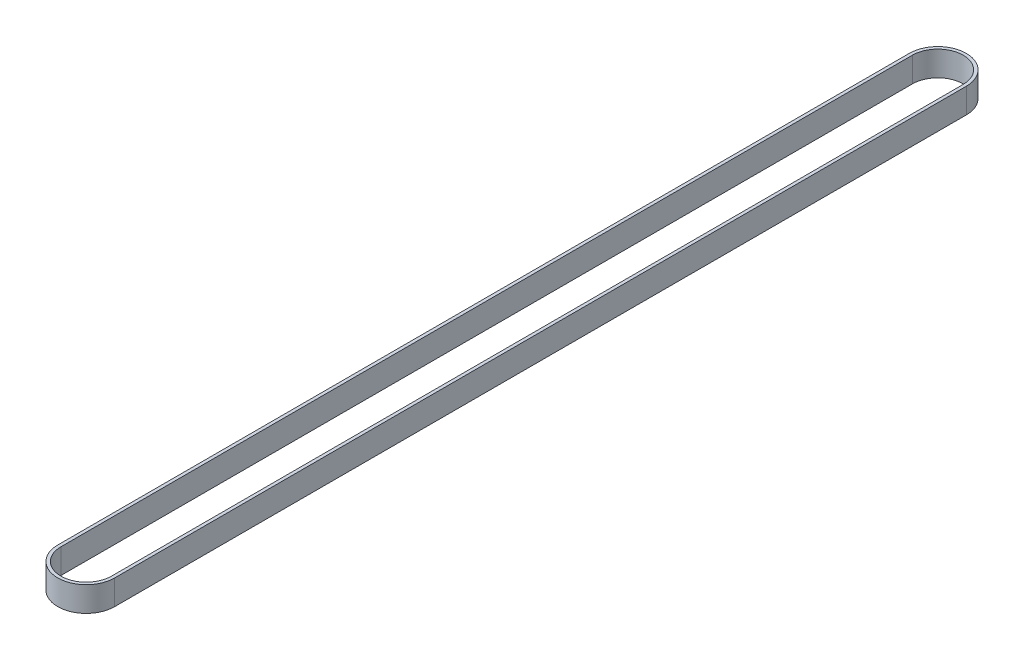
ISO-10303-21;
HEADER;
FILE_DESCRIPTION(('STEP AP214'),'2;1');
FILE_NAME('part.step','',(''),(''),'','','');
FILE_SCHEMA(('AUTOMOTIVE_DESIGN { 1 0 10303 214 1 1 1 1 }'));
ENDSEC;
DATA;
#1=APPLICATION_CONTEXT('core data for automotive mechanical design processes');
#2=APPLICATION_PROTOCOL_DEFINITION('international standard','automotive_design',2000,#1);
#3=PRODUCT_CONTEXT('',#1,'mechanical');
#4=PRODUCT('Part','Part','',(#3));
#5=PRODUCT_RELATED_PRODUCT_CATEGORY('part','',(#4));
#6=PRODUCT_DEFINITION_FORMATION('','',#4);
#7=PRODUCT_DEFINITION_CONTEXT('part definition',#1,'design');
#8=PRODUCT_DEFINITION('design','',#6,#7);
#9=PRODUCT_DEFINITION_SHAPE('','',#8);
#10=(LENGTH_UNIT() NAMED_UNIT(*) SI_UNIT(.MILLI.,.METRE.));
#11=(NAMED_UNIT(*) PLANE_ANGLE_UNIT() SI_UNIT($,.RADIAN.));
#12=(NAMED_UNIT(*) SI_UNIT($,.STERADIAN.) SOLID_ANGLE_UNIT());
#13=UNCERTAINTY_MEASURE_WITH_UNIT(LENGTH_MEASURE(1.E-05),#10,'distance_accuracy_value','');
#14=(GEOMETRIC_REPRESENTATION_CONTEXT(3) GLOBAL_UNCERTAINTY_ASSIGNED_CONTEXT((#13)) GLOBAL_UNIT_ASSIGNED_CONTEXT((#10,
#11,#12)) REPRESENTATION_CONTEXT('',''));
#15=CARTESIAN_POINT('',(0.,0.,0.));
#16=DIRECTION('',(0.,0.,1.));
#17=DIRECTION('',(1.,0.,0.));
#18=AXIS2_PLACEMENT_3D('',#15,#16,#17);
#19=CARTESIAN_POINT('',(0.,6.,102.55));
#20=DIRECTION('',(0.,1.,0.));
#21=DIRECTION('',(0.,0.,1.));
#22=AXIS2_PLACEMENT_3D('',#19,#20,#21);
#23=PLANE('',#22);
#24=CARTESIAN_POINT('',(0.,6.,102.55));
#25=DIRECTION('',(0.,1.,0.));
#26=DIRECTION('',(0.,0.,1.));
#27=AXIS2_PLACEMENT_3D('',#24,#25,#26);
#28=CIRCLE('',#27,6.86000000000003);
#29=CARTESIAN_POINT('',(-6.86000000000003,6.,102.55));
#30=VERTEX_POINT('',#29);
#31=CARTESIAN_POINT('',(6.86000000000003,6.,102.55));
#32=VERTEX_POINT('',#31);
#33=EDGE_CURVE('E157',#30,#32,#28,.T.);
#34=ORIENTED_EDGE('',*,*,#33,.T.);
#35=DIRECTION('',(0.,0.,-1.));
#36=VECTOR('',#35,1.);
#37=CARTESIAN_POINT('',(6.86000000000003,6.,102.55));
#38=LINE('',#37,#36);
#39=CARTESIAN_POINT('',(6.86,6.,-102.55));
#40=VERTEX_POINT('',#39);
#41=EDGE_CURVE('E161',#32,#40,#38,.T.);
#42=ORIENTED_EDGE('',*,*,#41,.T.);
#43=CARTESIAN_POINT('',(0.,6.,-102.55));
#44=DIRECTION('',(0.,1.,0.));
#45=DIRECTION('',(0.,0.,1.));
#46=AXIS2_PLACEMENT_3D('',#43,#44,#45);
#47=CIRCLE('',#46,6.86000000000003);
#48=CARTESIAN_POINT('',(-6.86000000000005,6.,-102.55));
#49=VERTEX_POINT('',#48);
#50=EDGE_CURVE('E165',#40,#49,#47,.T.);
#51=ORIENTED_EDGE('',*,*,#50,.T.);
#52=DIRECTION('',(0.,0.,1.));
#53=VECTOR('',#52,1.);
#54=CARTESIAN_POINT('',(-6.86000000000003,6.,102.55));
#55=LINE('',#54,#53);
#56=EDGE_CURVE('E168',#49,#30,#55,.T.);
#57=ORIENTED_EDGE('',*,*,#56,.T.);
#58=EDGE_LOOP('',(#34,#42,#51,#57));
#59=FACE_BOUND('',#58,.T.);
#60=DIRECTION('',(0.,0.,-1.));
#61=VECTOR('',#60,1.);
#62=CARTESIAN_POINT('',(6.11000000000004,6.,102.55));
#63=LINE('',#62,#61);
#64=CARTESIAN_POINT('',(6.11000000000004,6.,102.55));
#65=VERTEX_POINT('',#64);
#66=CARTESIAN_POINT('',(6.11,6.,-102.55));
#67=VERTEX_POINT('',#66);
#68=EDGE_CURVE('E118',#65,#67,#63,.T.);
#69=ORIENTED_EDGE('',*,*,#68,.F.);
#70=CARTESIAN_POINT('',(0.,6.,102.55));
#71=DIRECTION('',(0.,1.,0.));
#72=DIRECTION('',(0.,0.,1.));
#73=AXIS2_PLACEMENT_3D('',#70,#71,#72);
#74=CIRCLE('',#73,6.11);
#75=CARTESIAN_POINT('',(-6.10999999999997,6.,102.55));
#76=VERTEX_POINT('',#75);
#77=EDGE_CURVE('E109',#76,#65,#74,.T.);
#78=ORIENTED_EDGE('',*,*,#77,.F.);
#79=DIRECTION('',(0.,0.,1.));
#80=VECTOR('',#79,1.);
#81=CARTESIAN_POINT('',(-6.10999999999997,6.,102.55));
#82=LINE('',#81,#80);
#83=CARTESIAN_POINT('',(-6.11,6.,-102.55));
#84=VERTEX_POINT('',#83);
#85=EDGE_CURVE('E135',#84,#76,#82,.T.);
#86=ORIENTED_EDGE('',*,*,#85,.F.);
#87=CARTESIAN_POINT('',(0.,6.,-102.55));
#88=DIRECTION('',(0.,1.,0.));
#89=DIRECTION('',(0.,0.,1.));
#90=AXIS2_PLACEMENT_3D('',#87,#88,#89);
#91=CIRCLE('',#90,6.11);
#92=EDGE_CURVE('E131',#67,#84,#91,.T.);
#93=ORIENTED_EDGE('',*,*,#92,.F.);
#94=EDGE_LOOP('',(#69,#78,#86,#93));
#95=FACE_BOUND('',#94,.T.);
#96=ADVANCED_FACE('F43',(#59,#95),#23,.T.);
#97=CARTESIAN_POINT('',(0.,0.,102.55));
#98=DIRECTION('',(0.,1.,0.));
#99=DIRECTION('',(0.,0.,1.));
#100=AXIS2_PLACEMENT_3D('',#97,#98,#99);
#101=PLANE('',#100);
#102=CARTESIAN_POINT('',(0.,0.,102.55));
#103=DIRECTION('',(0.,1.,0.));
#104=DIRECTION('',(0.,0.,1.));
#105=AXIS2_PLACEMENT_3D('',#102,#103,#104);
#106=CIRCLE('',#105,6.86000000000003);
#107=CARTESIAN_POINT('',(-6.86000000000003,0.,102.55));
#108=VERTEX_POINT('',#107);
#109=CARTESIAN_POINT('',(6.86000000000003,0.,102.55));
#110=VERTEX_POINT('',#109);
#111=EDGE_CURVE('E127',#108,#110,#106,.T.);
#112=ORIENTED_EDGE('',*,*,#111,.F.);
#113=DIRECTION('',(0.,0.,1.));
#114=VECTOR('',#113,1.);
#115=CARTESIAN_POINT('',(-6.86000000000003,0.,102.55));
#116=LINE('',#115,#114);
#117=CARTESIAN_POINT('',(-6.86000000000005,0.,-102.55));
#118=VERTEX_POINT('',#117);
#119=EDGE_CURVE('E162',#118,#108,#116,.T.);
#120=ORIENTED_EDGE('',*,*,#119,.F.);
#121=CARTESIAN_POINT('',(0.,0.,-102.55));
#122=DIRECTION('',(0.,1.,0.));
#123=DIRECTION('',(0.,0.,1.));
#124=AXIS2_PLACEMENT_3D('',#121,#122,#123);
#125=CIRCLE('',#124,6.86000000000003);
#126=CARTESIAN_POINT('',(6.86,0.,-102.55));
#127=VERTEX_POINT('',#126);
#128=EDGE_CURVE('E178',#127,#118,#125,.T.);
#129=ORIENTED_EDGE('',*,*,#128,.F.);
#130=DIRECTION('',(0.,0.,-1.));
#131=VECTOR('',#130,1.);
#132=CARTESIAN_POINT('',(6.86000000000003,0.,102.55));
#133=LINE('',#132,#131);
#134=EDGE_CURVE('E175',#110,#127,#133,.T.);
#135=ORIENTED_EDGE('',*,*,#134,.F.);
#136=EDGE_LOOP('',(#112,#120,#129,#135));
#137=FACE_BOUND('',#136,.T.);
#138=CARTESIAN_POINT('',(0.,0.,102.55));
#139=DIRECTION('',(0.,1.,0.));
#140=DIRECTION('',(0.,0.,1.));
#141=AXIS2_PLACEMENT_3D('',#138,#139,#140);
#142=CIRCLE('',#141,6.11);
#143=CARTESIAN_POINT('',(-6.10999999999997,0.,102.55));
#144=VERTEX_POINT('',#143);
#145=CARTESIAN_POINT('',(6.11000000000004,0.,102.55));
#146=VERTEX_POINT('',#145);
#147=EDGE_CURVE('E67',#144,#146,#142,.T.);
#148=ORIENTED_EDGE('',*,*,#147,.T.);
#149=DIRECTION('',(0.,0.,-1.));
#150=VECTOR('',#149,1.);
#151=CARTESIAN_POINT('',(6.11000000000004,0.,102.55));
#152=LINE('',#151,#150);
#153=CARTESIAN_POINT('',(6.11,0.,-102.55));
#154=VERTEX_POINT('',#153);
#155=EDGE_CURVE('E125',#146,#154,#152,.T.);
#156=ORIENTED_EDGE('',*,*,#155,.T.);
#157=CARTESIAN_POINT('',(0.,0.,-102.55));
#158=DIRECTION('',(0.,1.,0.));
#159=DIRECTION('',(0.,0.,1.));
#160=AXIS2_PLACEMENT_3D('',#157,#158,#159);
#161=CIRCLE('',#160,6.11);
#162=CARTESIAN_POINT('',(-6.11,0.,-102.55));
#163=VERTEX_POINT('',#162);
#164=EDGE_CURVE('E144',#154,#163,#161,.T.);
#165=ORIENTED_EDGE('',*,*,#164,.T.);
#166=DIRECTION('',(0.,0.,1.));
#167=VECTOR('',#166,1.);
#168=CARTESIAN_POINT('',(-6.10999999999997,0.,102.55));
#169=LINE('',#168,#167);
#170=EDGE_CURVE('E119',#163,#144,#169,.T.);
#171=ORIENTED_EDGE('',*,*,#170,.T.);
#172=EDGE_LOOP('',(#148,#156,#165,#171));
#173=FACE_BOUND('',#172,.T.);
#174=ADVANCED_FACE('F201',(#137,#173),#101,.F.);
#175=CARTESIAN_POINT('',(0.,6.,102.55));
#176=DIRECTION('',(0.,-1.,0.));
#177=DIRECTION('',(0.,0.,-1.));
#178=AXIS2_PLACEMENT_3D('',#175,#176,#177);
#179=CYLINDRICAL_SURFACE('',#178,6.86000000000003);
#180=ORIENTED_EDGE('',*,*,#111,.T.);
#181=DIRECTION('',(0.,-1.,0.));
#182=VECTOR('',#181,1.);
#183=CARTESIAN_POINT('',(6.86000000000003,6.,102.55));
#184=LINE('',#183,#182);
#185=EDGE_CURVE('E11',#32,#110,#184,.T.);
#186=ORIENTED_EDGE('',*,*,#185,.F.);
#187=ORIENTED_EDGE('',*,*,#33,.F.);
#188=DIRECTION('',(0.,-1.,0.));
#189=VECTOR('',#188,1.);
#190=CARTESIAN_POINT('',(-6.86000000000003,6.,102.55));
#191=LINE('',#190,#189);
#192=EDGE_CURVE('E171',#30,#108,#191,.T.);
#193=ORIENTED_EDGE('',*,*,#192,.T.);
#194=EDGE_LOOP('',(#180,#186,#187,#193));
#195=FACE_BOUND('',#194,.T.);
#196=ADVANCED_FACE('F45',(#195),#179,.T.);
#197=CARTESIAN_POINT('',(6.86000000000003,6.,102.55));
#198=DIRECTION('',(-1.,0.,0.));
#199=DIRECTION('',(0.,0.,1.));
#200=AXIS2_PLACEMENT_3D('',#197,#198,#199);
#201=PLANE('',#200);
#202=ORIENTED_EDGE('',*,*,#134,.T.);
#203=DIRECTION('',(0.,-1.,0.));
#204=VECTOR('',#203,1.);
#205=CARTESIAN_POINT('',(6.86,6.,-102.55));
#206=LINE('',#205,#204);
#207=EDGE_CURVE('E52',#40,#127,#206,.T.);
#208=ORIENTED_EDGE('',*,*,#207,.F.);
#209=ORIENTED_EDGE('',*,*,#41,.F.);
#210=ORIENTED_EDGE('',*,*,#185,.T.);
#211=EDGE_LOOP('',(#202,#208,#209,#210));
#212=FACE_BOUND('',#211,.T.);
#213=ADVANCED_FACE('F211',(#212),#201,.F.);
#214=CARTESIAN_POINT('',(0.,6.,-102.55));
#215=DIRECTION('',(0.,-1.,0.));
#216=DIRECTION('',(0.,0.,-1.));
#217=AXIS2_PLACEMENT_3D('',#214,#215,#216);
#218=CYLINDRICAL_SURFACE('',#217,6.86000000000003);
#219=ORIENTED_EDGE('',*,*,#128,.T.);
#220=DIRECTION('',(0.,-1.,0.));
#221=VECTOR('',#220,1.);
#222=CARTESIAN_POINT('',(-6.86000000000005,6.,-102.55));
#223=LINE('',#222,#221);
#224=EDGE_CURVE('E186',#49,#118,#223,.T.);
#225=ORIENTED_EDGE('',*,*,#224,.F.);
#226=ORIENTED_EDGE('',*,*,#50,.F.);
#227=ORIENTED_EDGE('',*,*,#207,.T.);
#228=EDGE_LOOP('',(#219,#225,#226,#227));
#229=FACE_BOUND('',#228,.T.);
#230=ADVANCED_FACE('F195',(#229),#218,.T.);
#231=CARTESIAN_POINT('',(-6.86000000000003,6.,102.55));
#232=DIRECTION('',(1.,0.,0.));
#233=DIRECTION('',(0.,0.,-1.));
#234=AXIS2_PLACEMENT_3D('',#231,#232,#233);
#235=PLANE('',#234);
#236=ORIENTED_EDGE('',*,*,#119,.T.);
#237=ORIENTED_EDGE('',*,*,#192,.F.);
#238=ORIENTED_EDGE('',*,*,#56,.F.);
#239=ORIENTED_EDGE('',*,*,#224,.T.);
#240=EDGE_LOOP('',(#236,#237,#238,#239));
#241=FACE_BOUND('',#240,.T.);
#242=ADVANCED_FACE('F205',(#241),#235,.F.);
#243=CARTESIAN_POINT('',(0.,6.,102.55));
#244=DIRECTION('',(0.,-1.,0.));
#245=DIRECTION('',(0.,0.,-1.));
#246=AXIS2_PLACEMENT_3D('',#243,#244,#245);
#247=CYLINDRICAL_SURFACE('',#246,6.11);
#248=ORIENTED_EDGE('',*,*,#147,.F.);
#249=DIRECTION('',(0.,-1.,0.));
#250=VECTOR('',#249,1.);
#251=CARTESIAN_POINT('',(-6.10999999999997,6.,102.55));
#252=LINE('',#251,#250);
#253=EDGE_CURVE('E113',#76,#144,#252,.T.);
#254=ORIENTED_EDGE('',*,*,#253,.F.);
#255=ORIENTED_EDGE('',*,*,#77,.T.);
#256=DIRECTION('',(0.,-1.,0.));
#257=VECTOR('',#256,1.);
#258=CARTESIAN_POINT('',(6.11000000000004,6.,102.55));
#259=LINE('',#258,#257);
#260=EDGE_CURVE('E112',#65,#146,#259,.T.);
#261=ORIENTED_EDGE('',*,*,#260,.T.);
#262=EDGE_LOOP('',(#248,#254,#255,#261));
#263=FACE_BOUND('',#262,.T.);
#264=ADVANCED_FACE('F111',(#263),#247,.F.);
#265=CARTESIAN_POINT('',(6.11000000000004,6.,102.55));
#266=DIRECTION('',(-1.,0.,0.));
#267=DIRECTION('',(0.,0.,1.));
#268=AXIS2_PLACEMENT_3D('',#265,#266,#267);
#269=PLANE('',#268);
#270=ORIENTED_EDGE('',*,*,#155,.F.);
#271=ORIENTED_EDGE('',*,*,#260,.F.);
#272=ORIENTED_EDGE('',*,*,#68,.T.);
#273=DIRECTION('',(0.,-1.,0.));
#274=VECTOR('',#273,1.);
#275=CARTESIAN_POINT('',(6.11,6.,-102.55));
#276=LINE('',#275,#274);
#277=EDGE_CURVE('E128',#67,#154,#276,.T.);
#278=ORIENTED_EDGE('',*,*,#277,.T.);
#279=EDGE_LOOP('',(#270,#271,#272,#278));
#280=FACE_BOUND('',#279,.T.);
#281=ADVANCED_FACE('F122',(#280),#269,.T.);
#282=CARTESIAN_POINT('',(0.,6.,-102.55));
#283=DIRECTION('',(0.,-1.,0.));
#284=DIRECTION('',(0.,0.,-1.));
#285=AXIS2_PLACEMENT_3D('',#282,#283,#284);
#286=CYLINDRICAL_SURFACE('',#285,6.11);
#287=ORIENTED_EDGE('',*,*,#164,.F.);
#288=ORIENTED_EDGE('',*,*,#277,.F.);
#289=ORIENTED_EDGE('',*,*,#92,.T.);
#290=DIRECTION('',(0.,-1.,0.));
#291=VECTOR('',#290,1.);
#292=CARTESIAN_POINT('',(-6.11,6.,-102.55));
#293=LINE('',#292,#291);
#294=EDGE_CURVE('E59',#84,#163,#293,.T.);
#295=ORIENTED_EDGE('',*,*,#294,.T.);
#296=EDGE_LOOP('',(#287,#288,#289,#295));
#297=FACE_BOUND('',#296,.T.);
#298=ADVANCED_FACE('F234',(#297),#286,.F.);
#299=CARTESIAN_POINT('',(-6.10999999999997,6.,102.55));
#300=DIRECTION('',(1.,0.,0.));
#301=DIRECTION('',(0.,0.,-1.));
#302=AXIS2_PLACEMENT_3D('',#299,#300,#301);
#303=PLANE('',#302);
#304=ORIENTED_EDGE('',*,*,#170,.F.);
#305=ORIENTED_EDGE('',*,*,#294,.F.);
#306=ORIENTED_EDGE('',*,*,#85,.T.);
#307=ORIENTED_EDGE('',*,*,#253,.T.);
#308=EDGE_LOOP('',(#304,#305,#306,#307));
#309=FACE_BOUND('',#308,.T.);
#310=ADVANCED_FACE('F238',(#309),#303,.T.);
#311=CLOSED_SHELL('',(#96,#174,#196,#213,#230,#242,#264,#281,#298,#310));
#312=MANIFOLD_SOLID_BREP('B2',#311);
#313=ADVANCED_BREP_SHAPE_REPRESENTATION('',(#18,#312),#14);
#314=SHAPE_DEFINITION_REPRESENTATION(#9,#313);
ENDSEC;
END-ISO-10303-21;
